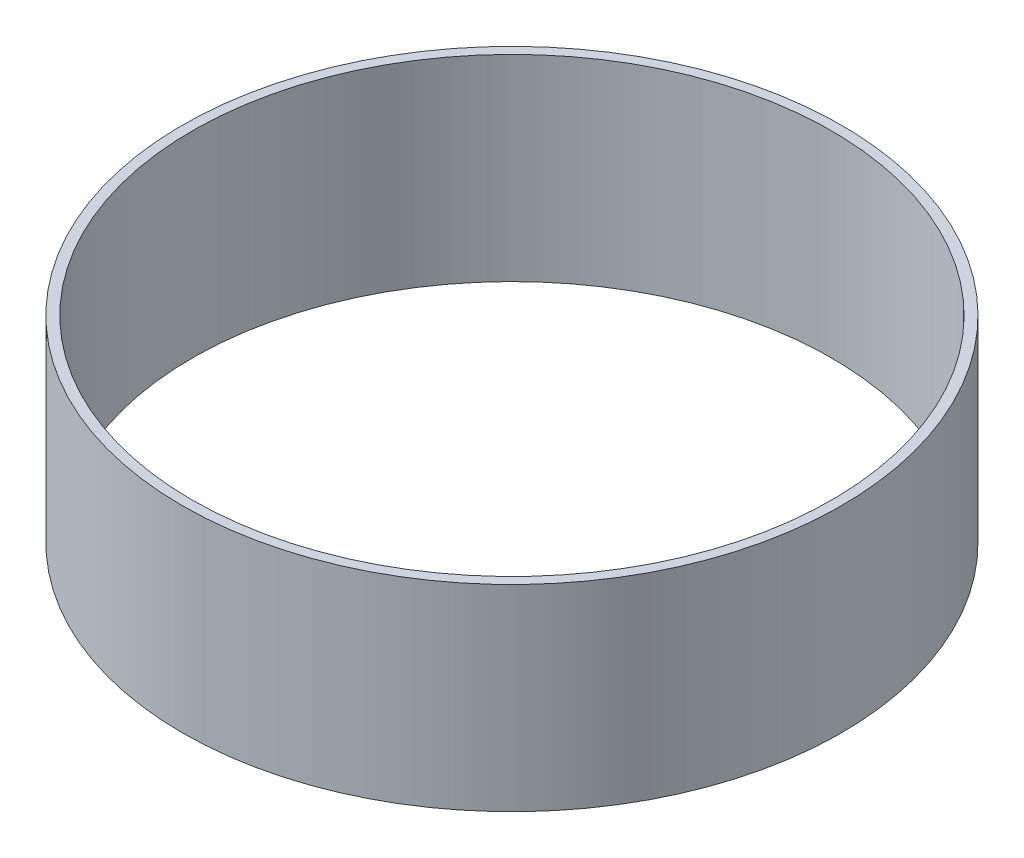
ISO-10303-21;
HEADER;
FILE_DESCRIPTION(('STEP AP214'),'2;1');
FILE_NAME('part.step','',(''),(''),'','','');
FILE_SCHEMA(('AUTOMOTIVE_DESIGN { 1 0 10303 214 1 1 1 1 }'));
ENDSEC;
DATA;
#1=APPLICATION_CONTEXT('core data for automotive mechanical design processes');
#2=APPLICATION_PROTOCOL_DEFINITION('international standard','automotive_design',2000,#1);
#3=PRODUCT_CONTEXT('',#1,'mechanical');
#4=PRODUCT('Part','Part','',(#3));
#5=PRODUCT_RELATED_PRODUCT_CATEGORY('part','',(#4));
#6=PRODUCT_DEFINITION_FORMATION('','',#4);
#7=PRODUCT_DEFINITION_CONTEXT('part definition',#1,'design');
#8=PRODUCT_DEFINITION('design','',#6,#7);
#9=PRODUCT_DEFINITION_SHAPE('','',#8);
#10=(LENGTH_UNIT() NAMED_UNIT(*) SI_UNIT(.MILLI.,.METRE.));
#11=(NAMED_UNIT(*) PLANE_ANGLE_UNIT() SI_UNIT($,.RADIAN.));
#12=(NAMED_UNIT(*) SI_UNIT($,.STERADIAN.) SOLID_ANGLE_UNIT());
#13=UNCERTAINTY_MEASURE_WITH_UNIT(LENGTH_MEASURE(1.E-05),#10,'distance_accuracy_value','');
#14=(GEOMETRIC_REPRESENTATION_CONTEXT(3) GLOBAL_UNCERTAINTY_ASSIGNED_CONTEXT((#13)) GLOBAL_UNIT_ASSIGNED_CONTEXT((#10,
#11,#12)) REPRESENTATION_CONTEXT('',''));
#15=CARTESIAN_POINT('',(0.,0.,0.));
#16=DIRECTION('',(0.,0.,1.));
#17=DIRECTION('',(1.,0.,0.));
#18=AXIS2_PLACEMENT_3D('',#15,#16,#17);
#19=CARTESIAN_POINT('',(0.,3048.,0.));
#20=DIRECTION('',(0.,1.,0.));
#21=DIRECTION('',(0.,0.,1.));
#22=AXIS2_PLACEMENT_3D('',#19,#20,#21);
#23=PLANE('',#22);
#24=CARTESIAN_POINT('',(0.,3048.,0.));
#25=DIRECTION('',(0.,1.,0.));
#26=DIRECTION('',(0.,0.,1.));
#27=AXIS2_PLACEMENT_3D('',#24,#25,#26);
#28=CIRCLE('',#27,5105.4);
#29=CARTESIAN_POINT('',(0.,3048.,5105.4));
#30=VERTEX_POINT('',#29);
#31=EDGE_CURVE('E10',#30,#30,#28,.T.);
#32=ORIENTED_EDGE('',*,*,#31,.T.);
#33=EDGE_LOOP('',(#32));
#34=FACE_BOUND('',#33,.T.);
#35=CARTESIAN_POINT('',(0.,3048.,0.));
#36=DIRECTION('',(0.,1.,0.));
#37=DIRECTION('',(0.,0.,1.));
#38=AXIS2_PLACEMENT_3D('',#35,#36,#37);
#39=CIRCLE('',#38,4953.);
#40=CARTESIAN_POINT('',(0.,3048.,4953.));
#41=VERTEX_POINT('',#40);
#42=EDGE_CURVE('E42',#41,#41,#39,.T.);
#43=ORIENTED_EDGE('',*,*,#42,.F.);
#44=EDGE_LOOP('',(#43));
#45=FACE_BOUND('',#44,.T.);
#46=ADVANCED_FACE('F31',(#34,#45),#23,.T.);
#47=CARTESIAN_POINT('',(0.,0.,0.));
#48=DIRECTION('',(0.,1.,0.));
#49=DIRECTION('',(0.,0.,1.));
#50=AXIS2_PLACEMENT_3D('',#47,#48,#49);
#51=PLANE('',#50);
#52=CARTESIAN_POINT('',(0.,0.,0.));
#53=DIRECTION('',(0.,1.,0.));
#54=DIRECTION('',(0.,0.,1.));
#55=AXIS2_PLACEMENT_3D('',#52,#53,#54);
#56=CIRCLE('',#55,5105.4);
#57=CARTESIAN_POINT('',(0.,0.,5105.4));
#58=VERTEX_POINT('',#57);
#59=EDGE_CURVE('E35',#58,#58,#56,.T.);
#60=ORIENTED_EDGE('',*,*,#59,.F.);
#61=EDGE_LOOP('',(#60));
#62=FACE_BOUND('',#61,.T.);
#63=CARTESIAN_POINT('',(0.,0.,0.));
#64=DIRECTION('',(0.,1.,0.));
#65=DIRECTION('',(0.,0.,1.));
#66=AXIS2_PLACEMENT_3D('',#63,#64,#65);
#67=CIRCLE('',#66,4953.);
#68=CARTESIAN_POINT('',(0.,0.,4953.));
#69=VERTEX_POINT('',#68);
#70=EDGE_CURVE('E44',#69,#69,#67,.T.);
#71=ORIENTED_EDGE('',*,*,#70,.T.);
#72=EDGE_LOOP('',(#71));
#73=FACE_BOUND('',#72,.T.);
#74=ADVANCED_FACE('F54',(#62,#73),#51,.F.);
#75=CARTESIAN_POINT('',(0.,3048.,0.));
#76=DIRECTION('',(0.,-1.,0.));
#77=DIRECTION('',(0.,0.,-1.));
#78=AXIS2_PLACEMENT_3D('',#75,#76,#77);
#79=CYLINDRICAL_SURFACE('',#78,5105.4);
#80=ORIENTED_EDGE('',*,*,#31,.F.);
#81=EDGE_LOOP('',(#80));
#82=FACE_BOUND('',#81,.T.);
#83=ORIENTED_EDGE('',*,*,#59,.T.);
#84=EDGE_LOOP('',(#83));
#85=FACE_BOUND('',#84,.T.);
#86=ADVANCED_FACE('F33',(#82,#85),#79,.T.);
#87=CARTESIAN_POINT('',(0.,3048.,0.));
#88=DIRECTION('',(0.,-1.,0.));
#89=DIRECTION('',(0.,0.,-1.));
#90=AXIS2_PLACEMENT_3D('',#87,#88,#89);
#91=CYLINDRICAL_SURFACE('',#90,4953.);
#92=ORIENTED_EDGE('',*,*,#42,.T.);
#93=EDGE_LOOP('',(#92));
#94=FACE_BOUND('',#93,.T.);
#95=ORIENTED_EDGE('',*,*,#70,.F.);
#96=EDGE_LOOP('',(#95));
#97=FACE_BOUND('',#96,.T.);
#98=ADVANCED_FACE('F50',(#94,#97),#91,.F.);
#99=CLOSED_SHELL('',(#46,#74,#86,#98));
#100=MANIFOLD_SOLID_BREP('B2',#99);
#101=ADVANCED_BREP_SHAPE_REPRESENTATION('',(#18,#100),#14);
#102=SHAPE_DEFINITION_REPRESENTATION(#9,#101);
ENDSEC;
END-ISO-10303-21;
